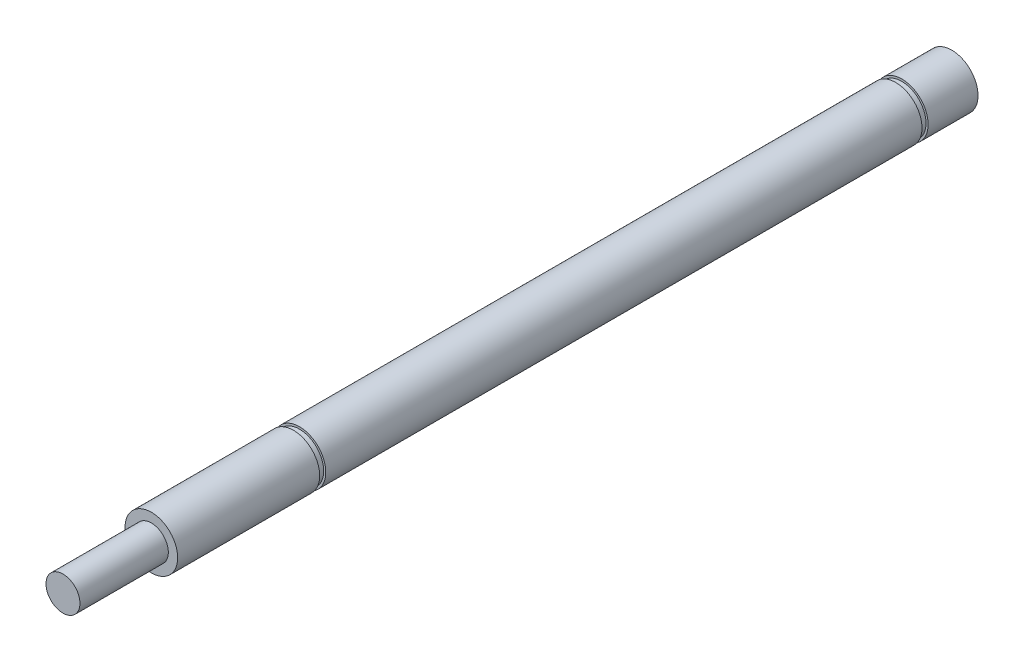
ISO-10303-21;
HEADER;
FILE_DESCRIPTION(('STEP AP214'),'2;1');
FILE_NAME('part.step','',(''),(''),'','','');
FILE_SCHEMA(('AUTOMOTIVE_DESIGN { 1 0 10303 214 1 1 1 1 }'));
ENDSEC;
DATA;
#1=APPLICATION_CONTEXT('core data for automotive mechanical design processes');
#2=APPLICATION_PROTOCOL_DEFINITION('international standard','automotive_design',2000,#1);
#3=PRODUCT_CONTEXT('',#1,'mechanical');
#4=PRODUCT('Part','Part','',(#3));
#5=PRODUCT_RELATED_PRODUCT_CATEGORY('part','',(#4));
#6=PRODUCT_DEFINITION_FORMATION('','',#4);
#7=PRODUCT_DEFINITION_CONTEXT('part definition',#1,'design');
#8=PRODUCT_DEFINITION('design','',#6,#7);
#9=PRODUCT_DEFINITION_SHAPE('','',#8);
#10=(LENGTH_UNIT() NAMED_UNIT(*) SI_UNIT(.MILLI.,.METRE.));
#11=(NAMED_UNIT(*) PLANE_ANGLE_UNIT() SI_UNIT($,.RADIAN.));
#12=(NAMED_UNIT(*) SI_UNIT($,.STERADIAN.) SOLID_ANGLE_UNIT());
#13=UNCERTAINTY_MEASURE_WITH_UNIT(LENGTH_MEASURE(1.E-05),#10,'distance_accuracy_value','');
#14=(GEOMETRIC_REPRESENTATION_CONTEXT(3) GLOBAL_UNCERTAINTY_ASSIGNED_CONTEXT((#13)) GLOBAL_UNIT_ASSIGNED_CONTEXT((#10,
#11,#12)) REPRESENTATION_CONTEXT('',''));
#15=CARTESIAN_POINT('',(0.,0.,0.));
#16=DIRECTION('',(0.,0.,1.));
#17=DIRECTION('',(1.,0.,0.));
#18=AXIS2_PLACEMENT_3D('',#15,#16,#17);
#19=CARTESIAN_POINT('',(15.304322218472,24.703467801772,-93.4455536822282));
#20=DIRECTION('',(0.,0.,-1.));
#21=DIRECTION('',(-1.,0.,0.));
#22=AXIS2_PLACEMENT_3D('',#19,#20,#21);
#23=CYLINDRICAL_SURFACE('',#22,2.05);
#24=CARTESIAN_POINT('',(15.304322218472,24.703467801772,13.843));
#25=DIRECTION('',(0.,0.,-1.));
#26=DIRECTION('',(-1.,0.,0.));
#27=AXIS2_PLACEMENT_3D('',#24,#25,#26);
#28=CIRCLE('',#27,2.05);
#29=CARTESIAN_POINT('',(13.254322218472,24.703467801772,13.843));
#30=VERTEX_POINT('',#29);
#31=EDGE_CURVE('E10',#30,#30,#28,.T.);
#32=ORIENTED_EDGE('',*,*,#31,.T.);
#33=EDGE_LOOP('',(#32));
#34=FACE_BOUND('',#33,.T.);
#35=CARTESIAN_POINT('',(15.304322218472,24.703467801772,3.17500000000009));
#36=DIRECTION('',(0.,0.,-1.));
#37=DIRECTION('',(-1.,0.,0.));
#38=AXIS2_PLACEMENT_3D('',#35,#36,#37);
#39=CIRCLE('',#38,2.05);
#40=CARTESIAN_POINT('',(13.254322218472,24.703467801772,3.17500000000009));
#41=VERTEX_POINT('',#40);
#42=EDGE_CURVE('E73',#41,#41,#39,.T.);
#43=ORIENTED_EDGE('',*,*,#42,.F.);
#44=EDGE_LOOP('',(#43));
#45=FACE_BOUND('',#44,.T.);
#46=ADVANCED_FACE('F33',(#34,#45),#23,.T.);
#47=CARTESIAN_POINT('',(15.304322218472,26.753467801772,13.843));
#48=DIRECTION('',(0.,0.,1.));
#49=DIRECTION('',(1.,0.,0.));
#50=AXIS2_PLACEMENT_3D('',#47,#48,#49);
#51=PLANE('',#50);
#52=ORIENTED_EDGE('',*,*,#31,.F.);
#53=EDGE_LOOP('',(#52));
#54=FACE_BOUND('',#53,.T.);
#55=ADVANCED_FACE('F81',(#54),#51,.T.);
#56=CARTESIAN_POINT('',(15.304322218472,27.878467801772,-93.4455536822282));
#57=DIRECTION('',(0.,0.,-1.));
#58=DIRECTION('',(-1.,0.,0.));
#59=AXIS2_PLACEMENT_3D('',#56,#57,#58);
#60=PLANE('',#59);
#61=CARTESIAN_POINT('',(15.304322218472,24.703467801772,-93.4455536822282));
#62=DIRECTION('',(0.,0.,-1.));
#63=DIRECTION('',(-1.,0.,0.));
#64=AXIS2_PLACEMENT_3D('',#61,#62,#63);
#65=CIRCLE('',#64,3.175);
#66=CARTESIAN_POINT('',(12.129322218472,24.703467801772,-93.4455536822282));
#67=VERTEX_POINT('',#66);
#68=EDGE_CURVE('E39',#67,#67,#65,.T.);
#69=ORIENTED_EDGE('',*,*,#68,.T.);
#70=EDGE_LOOP('',(#69));
#71=FACE_BOUND('',#70,.T.);
#72=ADVANCED_FACE('F85',(#71),#60,.T.);
#73=CARTESIAN_POINT('',(15.304322218472,24.703467801772,-93.4455536822282));
#74=DIRECTION('',(0.,0.,-1.));
#75=DIRECTION('',(-1.,0.,0.));
#76=AXIS2_PLACEMENT_3D('',#73,#74,#75);
#77=CYLINDRICAL_SURFACE('',#76,3.175);
#78=CARTESIAN_POINT('',(15.304322218472,24.703467801772,-87.4194036822282));
#79=DIRECTION('',(0.,0.,-1.));
#80=DIRECTION('',(-1.,0.,0.));
#81=AXIS2_PLACEMENT_3D('',#78,#79,#80);
#82=CIRCLE('',#81,3.175);
#83=CARTESIAN_POINT('',(12.129322218472,24.703467801772,-87.4194036822282));
#84=VERTEX_POINT('',#83);
#85=EDGE_CURVE('E43',#84,#84,#82,.T.);
#86=ORIENTED_EDGE('',*,*,#85,.T.);
#87=EDGE_LOOP('',(#86));
#88=FACE_BOUND('',#87,.T.);
#89=ORIENTED_EDGE('',*,*,#68,.F.);
#90=EDGE_LOOP('',(#89));
#91=FACE_BOUND('',#90,.T.);
#92=ADVANCED_FACE('F90',(#88,#91),#77,.T.);
#93=CARTESIAN_POINT('',(15.304322218472,27.878467801772,-87.4194036822282));
#94=DIRECTION('',(0.,0.,1.));
#95=DIRECTION('',(1.,0.,0.));
#96=AXIS2_PLACEMENT_3D('',#93,#94,#95);
#97=PLANE('',#96);
#98=CARTESIAN_POINT('',(15.304322218472,24.703467801772,-87.4194036822282));
#99=DIRECTION('',(0.,0.,-1.));
#100=DIRECTION('',(-1.,0.,0.));
#101=AXIS2_PLACEMENT_3D('',#98,#99,#100);
#102=CIRCLE('',#101,2.921);
#103=CARTESIAN_POINT('',(12.383322218472,24.703467801772,-87.4194036822282));
#104=VERTEX_POINT('',#103);
#105=EDGE_CURVE('E47',#104,#104,#102,.T.);
#106=ORIENTED_EDGE('',*,*,#105,.T.);
#107=EDGE_LOOP('',(#106));
#108=FACE_BOUND('',#107,.T.);
#109=ORIENTED_EDGE('',*,*,#85,.F.);
#110=EDGE_LOOP('',(#109));
#111=FACE_BOUND('',#110,.T.);
#112=ADVANCED_FACE('F95',(#108,#111),#97,.T.);
#113=CARTESIAN_POINT('',(15.304322218472,24.703467801772,-93.4455536822282));
#114=DIRECTION('',(0.,0.,-1.));
#115=DIRECTION('',(-1.,0.,0.));
#116=AXIS2_PLACEMENT_3D('',#113,#114,#115);
#117=CYLINDRICAL_SURFACE('',#116,2.921);
#118=CARTESIAN_POINT('',(15.304322218472,24.703467801772,-86.6828036822282));
#119=DIRECTION('',(0.,0.,-1.));
#120=DIRECTION('',(-1.,0.,0.));
#121=AXIS2_PLACEMENT_3D('',#118,#119,#120);
#122=CIRCLE('',#121,2.921);
#123=CARTESIAN_POINT('',(12.383322218472,24.703467801772,-86.6828036822282));
#124=VERTEX_POINT('',#123);
#125=EDGE_CURVE('E52',#124,#124,#122,.T.);
#126=ORIENTED_EDGE('',*,*,#125,.T.);
#127=EDGE_LOOP('',(#126));
#128=FACE_BOUND('',#127,.T.);
#129=ORIENTED_EDGE('',*,*,#105,.F.);
#130=EDGE_LOOP('',(#129));
#131=FACE_BOUND('',#130,.T.);
#132=ADVANCED_FACE('F99',(#128,#131),#117,.T.);
#133=CARTESIAN_POINT('',(15.304322218472,27.878467801772,-86.6828036822282));
#134=DIRECTION('',(0.,0.,-1.));
#135=DIRECTION('',(-1.,0.,0.));
#136=AXIS2_PLACEMENT_3D('',#133,#134,#135);
#137=PLANE('',#136);
#138=CARTESIAN_POINT('',(15.304322218472,24.703467801772,-86.6828036822282));
#139=DIRECTION('',(0.,0.,-1.));
#140=DIRECTION('',(-1.,0.,0.));
#141=AXIS2_PLACEMENT_3D('',#138,#139,#140);
#142=CIRCLE('',#141,3.175);
#143=CARTESIAN_POINT('',(12.129322218472,24.703467801772,-86.6828036822282));
#144=VERTEX_POINT('',#143);
#145=EDGE_CURVE('E55',#144,#144,#142,.T.);
#146=ORIENTED_EDGE('',*,*,#145,.T.);
#147=EDGE_LOOP('',(#146));
#148=FACE_BOUND('',#147,.T.);
#149=ORIENTED_EDGE('',*,*,#125,.F.);
#150=EDGE_LOOP('',(#149));
#151=FACE_BOUND('',#150,.T.);
#152=ADVANCED_FACE('F103',(#148,#151),#137,.T.);
#153=CARTESIAN_POINT('',(15.304322218472,24.703467801772,-93.4455536822282));
#154=DIRECTION('',(0.,0.,-1.));
#155=DIRECTION('',(-1.,0.,0.));
#156=AXIS2_PLACEMENT_3D('',#153,#154,#155);
#157=CYLINDRICAL_SURFACE('',#156,3.175);
#158=CARTESIAN_POINT('',(15.304322218472,24.703467801772,-14.7066));
#159=DIRECTION('',(0.,0.,-1.));
#160=DIRECTION('',(-1.,0.,0.));
#161=AXIS2_PLACEMENT_3D('',#158,#159,#160);
#162=CIRCLE('',#161,3.175);
#163=CARTESIAN_POINT('',(12.129322218472,24.703467801772,-14.7066));
#164=VERTEX_POINT('',#163);
#165=EDGE_CURVE('E58',#164,#164,#162,.T.);
#166=ORIENTED_EDGE('',*,*,#165,.T.);
#167=EDGE_LOOP('',(#166));
#168=FACE_BOUND('',#167,.T.);
#169=ORIENTED_EDGE('',*,*,#145,.F.);
#170=EDGE_LOOP('',(#169));
#171=FACE_BOUND('',#170,.T.);
#172=ADVANCED_FACE('F107',(#168,#171),#157,.T.);
#173=CARTESIAN_POINT('',(15.304322218472,27.878467801772,-14.7066));
#174=DIRECTION('',(0.,0.,1.));
#175=DIRECTION('',(1.,0.,0.));
#176=AXIS2_PLACEMENT_3D('',#173,#174,#175);
#177=PLANE('',#176);
#178=CARTESIAN_POINT('',(15.304322218472,24.703467801772,-14.7066));
#179=DIRECTION('',(0.,0.,-1.));
#180=DIRECTION('',(-1.,0.,0.));
#181=AXIS2_PLACEMENT_3D('',#178,#179,#180);
#182=CIRCLE('',#181,2.921);
#183=CARTESIAN_POINT('',(12.383322218472,24.703467801772,-14.7066));
#184=VERTEX_POINT('',#183);
#185=EDGE_CURVE('E61',#184,#184,#182,.T.);
#186=ORIENTED_EDGE('',*,*,#185,.T.);
#187=EDGE_LOOP('',(#186));
#188=FACE_BOUND('',#187,.T.);
#189=ORIENTED_EDGE('',*,*,#165,.F.);
#190=EDGE_LOOP('',(#189));
#191=FACE_BOUND('',#190,.T.);
#192=ADVANCED_FACE('F111',(#188,#191),#177,.T.);
#193=CARTESIAN_POINT('',(15.304322218472,24.703467801772,-93.4455536822282));
#194=DIRECTION('',(0.,0.,-1.));
#195=DIRECTION('',(-1.,0.,0.));
#196=AXIS2_PLACEMENT_3D('',#193,#194,#195);
#197=CYLINDRICAL_SURFACE('',#196,2.921);
#198=CARTESIAN_POINT('',(15.304322218472,24.703467801772,-13.97));
#199=DIRECTION('',(0.,0.,-1.));
#200=DIRECTION('',(-1.,0.,0.));
#201=AXIS2_PLACEMENT_3D('',#198,#199,#200);
#202=CIRCLE('',#201,2.921);
#203=CARTESIAN_POINT('',(12.383322218472,24.703467801772,-13.97));
#204=VERTEX_POINT('',#203);
#205=EDGE_CURVE('E64',#204,#204,#202,.T.);
#206=ORIENTED_EDGE('',*,*,#205,.T.);
#207=EDGE_LOOP('',(#206));
#208=FACE_BOUND('',#207,.T.);
#209=ORIENTED_EDGE('',*,*,#185,.F.);
#210=EDGE_LOOP('',(#209));
#211=FACE_BOUND('',#210,.T.);
#212=ADVANCED_FACE('F115',(#208,#211),#197,.T.);
#213=CARTESIAN_POINT('',(15.304322218472,27.878467801772,-13.97));
#214=DIRECTION('',(0.,0.,-1.));
#215=DIRECTION('',(-1.,0.,0.));
#216=AXIS2_PLACEMENT_3D('',#213,#214,#215);
#217=PLANE('',#216);
#218=CARTESIAN_POINT('',(15.304322218472,24.703467801772,-13.97));
#219=DIRECTION('',(0.,0.,-1.));
#220=DIRECTION('',(-1.,0.,0.));
#221=AXIS2_PLACEMENT_3D('',#218,#219,#220);
#222=CIRCLE('',#221,3.175);
#223=CARTESIAN_POINT('',(12.129322218472,24.703467801772,-13.97));
#224=VERTEX_POINT('',#223);
#225=EDGE_CURVE('E67',#224,#224,#222,.T.);
#226=ORIENTED_EDGE('',*,*,#225,.T.);
#227=EDGE_LOOP('',(#226));
#228=FACE_BOUND('',#227,.T.);
#229=ORIENTED_EDGE('',*,*,#205,.F.);
#230=EDGE_LOOP('',(#229));
#231=FACE_BOUND('',#230,.T.);
#232=ADVANCED_FACE('F119',(#228,#231),#217,.T.);
#233=CARTESIAN_POINT('',(15.304322218472,24.703467801772,-93.4455536822282));
#234=DIRECTION('',(0.,0.,-1.));
#235=DIRECTION('',(-1.,0.,0.));
#236=AXIS2_PLACEMENT_3D('',#233,#234,#235);
#237=CYLINDRICAL_SURFACE('',#236,3.175);
#238=CARTESIAN_POINT('',(15.304322218472,24.703467801772,3.175));
#239=DIRECTION('',(0.,0.,-1.));
#240=DIRECTION('',(-1.,0.,0.));
#241=AXIS2_PLACEMENT_3D('',#238,#239,#240);
#242=CIRCLE('',#241,3.175);
#243=CARTESIAN_POINT('',(12.129322218472,24.703467801772,3.175));
#244=VERTEX_POINT('',#243);
#245=EDGE_CURVE('E70',#244,#244,#242,.T.);
#246=ORIENTED_EDGE('',*,*,#245,.T.);
#247=EDGE_LOOP('',(#246));
#248=FACE_BOUND('',#247,.T.);
#249=ORIENTED_EDGE('',*,*,#225,.F.);
#250=EDGE_LOOP('',(#249));
#251=FACE_BOUND('',#250,.T.);
#252=ADVANCED_FACE('F123',(#248,#251),#237,.T.);
#253=CARTESIAN_POINT('',(15.304322218472,27.878467801772,3.17500000000004));
#254=DIRECTION('',(0.,0.,1.));
#255=DIRECTION('',(1.,0.,0.));
#256=AXIS2_PLACEMENT_3D('',#253,#254,#255);
#257=PLANE('',#256);
#258=ORIENTED_EDGE('',*,*,#42,.T.);
#259=EDGE_LOOP('',(#258));
#260=FACE_BOUND('',#259,.T.);
#261=ORIENTED_EDGE('',*,*,#245,.F.);
#262=EDGE_LOOP('',(#261));
#263=FACE_BOUND('',#262,.T.);
#264=ADVANCED_FACE('F77',(#260,#263),#257,.T.);
#265=CLOSED_SHELL('',(#46,#55,#72,#92,#112,#132,#152,#172,#192,#212,#232,#252,#264));
#266=MANIFOLD_SOLID_BREP('B2',#265);
#267=ADVANCED_BREP_SHAPE_REPRESENTATION('',(#18,#266),#14);
#268=SHAPE_DEFINITION_REPRESENTATION(#9,#267);
ENDSEC;
END-ISO-10303-21;
